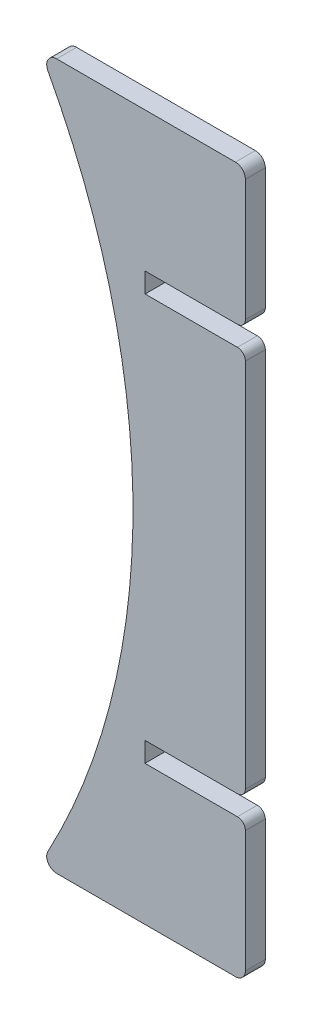
ISO-10303-21;
HEADER;
FILE_DESCRIPTION(('STEP AP214'),'2;1');
FILE_NAME('part.step','',(''),(''),'','','');
FILE_SCHEMA(('AUTOMOTIVE_DESIGN { 1 0 10303 214 1 1 1 1 }'));
ENDSEC;
DATA;
#1=APPLICATION_CONTEXT('core data for automotive mechanical design processes');
#2=APPLICATION_PROTOCOL_DEFINITION('international standard','automotive_design',2000,#1);
#3=PRODUCT_CONTEXT('',#1,'mechanical');
#4=PRODUCT('Part','Part','',(#3));
#5=PRODUCT_RELATED_PRODUCT_CATEGORY('part','',(#4));
#6=PRODUCT_DEFINITION_FORMATION('','',#4);
#7=PRODUCT_DEFINITION_CONTEXT('part definition',#1,'design');
#8=PRODUCT_DEFINITION('design','',#6,#7);
#9=PRODUCT_DEFINITION_SHAPE('','',#8);
#10=(LENGTH_UNIT() NAMED_UNIT(*) SI_UNIT(.MILLI.,.METRE.));
#11=(NAMED_UNIT(*) PLANE_ANGLE_UNIT() SI_UNIT($,.RADIAN.));
#12=(NAMED_UNIT(*) SI_UNIT($,.STERADIAN.) SOLID_ANGLE_UNIT());
#13=UNCERTAINTY_MEASURE_WITH_UNIT(LENGTH_MEASURE(1.E-05),#10,'distance_accuracy_value','');
#14=(GEOMETRIC_REPRESENTATION_CONTEXT(3) GLOBAL_UNCERTAINTY_ASSIGNED_CONTEXT((#13)) GLOBAL_UNIT_ASSIGNED_CONTEXT((#10,
#11,#12)) REPRESENTATION_CONTEXT('',''));
#15=CARTESIAN_POINT('',(0.,0.,0.));
#16=DIRECTION('',(0.,0.,1.));
#17=DIRECTION('',(1.,0.,0.));
#18=AXIS2_PLACEMENT_3D('',#15,#16,#17);
#19=CARTESIAN_POINT('',(8.95890816800005,85.500001303239,5.));
#20=DIRECTION('',(0.,0.,-1.));
#21=DIRECTION('',(-1.,0.,0.));
#22=AXIS2_PLACEMENT_3D('',#19,#20,#21);
#23=CYLINDRICAL_SURFACE('',#22,2.);
#24=CARTESIAN_POINT('',(8.95890816800005,85.500001303239,0.));
#25=DIRECTION('',(0.,0.,1.));
#26=DIRECTION('',(1.,0.,0.));
#27=AXIS2_PLACEMENT_3D('',#24,#25,#26);
#28=CIRCLE('',#27,2.);
#29=CARTESIAN_POINT('',(10.958908168,85.500001303239,0.));
#30=VERTEX_POINT('',#29);
#31=CARTESIAN_POINT('',(8.95890816800005,87.500001303239,0.));
#32=VERTEX_POINT('',#31);
#33=EDGE_CURVE('E201',#30,#32,#28,.T.);
#34=ORIENTED_EDGE('',*,*,#33,.T.);
#35=DIRECTION('',(0.,0.,-1.));
#36=VECTOR('',#35,1.);
#37=CARTESIAN_POINT('',(8.95890816800005,87.500001303239,5.));
#38=LINE('',#37,#36);
#39=CARTESIAN_POINT('',(8.95890816800005,87.500001303239,5.));
#40=VERTEX_POINT('',#39);
#41=EDGE_CURVE('E11',#40,#32,#38,.T.);
#42=ORIENTED_EDGE('',*,*,#41,.F.);
#43=CARTESIAN_POINT('',(8.95890816800005,85.500001303239,5.));
#44=DIRECTION('',(0.,0.,1.));
#45=DIRECTION('',(1.,0.,0.));
#46=AXIS2_PLACEMENT_3D('',#43,#44,#45);
#47=CIRCLE('',#46,2.);
#48=CARTESIAN_POINT('',(10.958908168,85.500001303239,5.));
#49=VERTEX_POINT('',#48);
#50=EDGE_CURVE('E239',#49,#40,#47,.T.);
#51=ORIENTED_EDGE('',*,*,#50,.F.);
#52=DIRECTION('',(0.,0.,-1.));
#53=VECTOR('',#52,1.);
#54=CARTESIAN_POINT('',(10.958908168,85.500001303239,5.));
#55=LINE('',#54,#53);
#56=EDGE_CURVE('E197',#49,#30,#55,.T.);
#57=ORIENTED_EDGE('',*,*,#56,.T.);
#58=EDGE_LOOP('',(#34,#42,#51,#57));
#59=FACE_BOUND('',#58,.T.);
#60=ADVANCED_FACE('F33',(#59),#23,.T.);
#61=CARTESIAN_POINT('',(-14.2050345422933,87.500001303239,5.));
#62=DIRECTION('',(0.,-1.,0.));
#63=DIRECTION('',(0.,0.,-1.));
#64=AXIS2_PLACEMENT_3D('',#61,#62,#63);
#65=PLANE('',#64);
#66=DIRECTION('',(-1.,0.,0.));
#67=VECTOR('',#66,1.);
#68=CARTESIAN_POINT('',(-14.2050345422933,87.500001303239,0.));
#69=LINE('',#68,#67);
#70=CARTESIAN_POINT('',(-14.2050345422933,87.500001303239,0.));
#71=VERTEX_POINT('',#70);
#72=EDGE_CURVE('E204',#32,#71,#69,.T.);
#73=ORIENTED_EDGE('',*,*,#72,.T.);
#74=DIRECTION('',(0.,0.,-1.));
#75=VECTOR('',#74,1.);
#76=CARTESIAN_POINT('',(-14.2050345422933,87.500001303239,5.));
#77=LINE('',#76,#75);
#78=CARTESIAN_POINT('',(-14.2050345422933,87.500001303239,5.));
#79=VERTEX_POINT('',#78);
#80=EDGE_CURVE('E41',#79,#71,#77,.T.);
#81=ORIENTED_EDGE('',*,*,#80,.F.);
#82=DIRECTION('',(-1.,0.,0.));
#83=VECTOR('',#82,1.);
#84=CARTESIAN_POINT('',(-14.2050345422933,87.500001303239,5.));
#85=LINE('',#84,#83);
#86=EDGE_CURVE('E128',#40,#79,#85,.T.);
#87=ORIENTED_EDGE('',*,*,#86,.F.);
#88=ORIENTED_EDGE('',*,*,#41,.T.);
#89=EDGE_LOOP('',(#73,#81,#87,#88));
#90=FACE_BOUND('',#89,.T.);
#91=ADVANCED_FACE('F357',(#90),#65,.F.);
#92=CARTESIAN_POINT('',(-14.2050345422933,92.5000013777448,5.));
#93=DIRECTION('',(-1.,0.,0.));
#94=DIRECTION('',(0.,-1.,0.));
#95=AXIS2_PLACEMENT_3D('',#92,#93,#94);
#96=PLANE('',#95);
#97=DIRECTION('',(0.,1.,0.));
#98=VECTOR('',#97,1.);
#99=CARTESIAN_POINT('',(-14.2050345422933,92.5000013777448,0.));
#100=LINE('',#99,#98);
#101=CARTESIAN_POINT('',(-14.2050345422933,92.5000013777448,0.));
#102=VERTEX_POINT('',#101);
#103=EDGE_CURVE('E206',#71,#102,#100,.T.);
#104=ORIENTED_EDGE('',*,*,#103,.T.);
#105=DIRECTION('',(0.,0.,-1.));
#106=VECTOR('',#105,1.);
#107=CARTESIAN_POINT('',(-14.2050345422933,92.5000013777448,5.));
#108=LINE('',#107,#106);
#109=CARTESIAN_POINT('',(-14.2050345422933,92.5000013777448,5.));
#110=VERTEX_POINT('',#109);
#111=EDGE_CURVE('E282',#110,#102,#108,.T.);
#112=ORIENTED_EDGE('',*,*,#111,.F.);
#113=DIRECTION('',(0.,1.,0.));
#114=VECTOR('',#113,1.);
#115=CARTESIAN_POINT('',(-14.2050345422933,92.5000013777448,5.));
#116=LINE('',#115,#114);
#117=EDGE_CURVE('E290',#79,#110,#116,.T.);
#118=ORIENTED_EDGE('',*,*,#117,.F.);
#119=ORIENTED_EDGE('',*,*,#80,.T.);
#120=EDGE_LOOP('',(#104,#112,#118,#119));
#121=FACE_BOUND('',#120,.T.);
#122=ADVANCED_FACE('F288',(#121),#96,.F.);
#123=CARTESIAN_POINT('',(8.95890816800005,92.5000013777448,5.));
#124=DIRECTION('',(0.,1.,0.));
#125=DIRECTION('',(0.,0.,1.));
#126=AXIS2_PLACEMENT_3D('',#123,#124,#125);
#127=PLANE('',#126);
#128=DIRECTION('',(1.,0.,0.));
#129=VECTOR('',#128,1.);
#130=CARTESIAN_POINT('',(8.95890816800005,92.5000013777448,0.));
#131=LINE('',#130,#129);
#132=CARTESIAN_POINT('',(8.95890816800005,92.5000013777448,0.));
#133=VERTEX_POINT('',#132);
#134=EDGE_CURVE('E208',#102,#133,#131,.T.);
#135=ORIENTED_EDGE('',*,*,#134,.T.);
#136=DIRECTION('',(0.,0.,-1.));
#137=VECTOR('',#136,1.);
#138=CARTESIAN_POINT('',(8.95890816800005,92.5000013777448,5.));
#139=LINE('',#138,#137);
#140=CARTESIAN_POINT('',(8.95890816800005,92.5000013777448,5.));
#141=VERTEX_POINT('',#140);
#142=EDGE_CURVE('E279',#141,#133,#139,.T.);
#143=ORIENTED_EDGE('',*,*,#142,.F.);
#144=DIRECTION('',(1.,0.,0.));
#145=VECTOR('',#144,1.);
#146=CARTESIAN_POINT('',(8.95890816800005,92.5000013777448,5.));
#147=LINE('',#146,#145);
#148=EDGE_CURVE('E308',#110,#141,#147,.T.);
#149=ORIENTED_EDGE('',*,*,#148,.F.);
#150=ORIENTED_EDGE('',*,*,#111,.T.);
#151=EDGE_LOOP('',(#135,#143,#149,#150));
#152=FACE_BOUND('',#151,.T.);
#153=ADVANCED_FACE('F299',(#152),#127,.F.);
#154=CARTESIAN_POINT('',(8.95890816800005,94.5000013777448,5.));
#155=DIRECTION('',(0.,0.,-1.));
#156=DIRECTION('',(-1.,0.,0.));
#157=AXIS2_PLACEMENT_3D('',#154,#155,#156);
#158=CYLINDRICAL_SURFACE('',#157,2.);
#159=CARTESIAN_POINT('',(8.95890816800005,94.5000013777448,0.));
#160=DIRECTION('',(0.,0.,1.));
#161=DIRECTION('',(1.,0.,0.));
#162=AXIS2_PLACEMENT_3D('',#159,#160,#161);
#163=CIRCLE('',#162,2.);
#164=CARTESIAN_POINT('',(10.9589081680001,94.5000013777448,0.));
#165=VERTEX_POINT('',#164);
#166=EDGE_CURVE('E210',#133,#165,#163,.T.);
#167=ORIENTED_EDGE('',*,*,#166,.T.);
#168=DIRECTION('',(0.,0.,-1.));
#169=VECTOR('',#168,1.);
#170=CARTESIAN_POINT('',(10.9589081680001,94.5000013777448,5.));
#171=LINE('',#170,#169);
#172=CARTESIAN_POINT('',(10.9589081680001,94.5000013777448,5.));
#173=VERTEX_POINT('',#172);
#174=EDGE_CURVE('E276',#173,#165,#171,.T.);
#175=ORIENTED_EDGE('',*,*,#174,.F.);
#176=CARTESIAN_POINT('',(8.95890816800005,94.5000013777448,5.));
#177=DIRECTION('',(0.,0.,1.));
#178=DIRECTION('',(1.,0.,0.));
#179=AXIS2_PLACEMENT_3D('',#176,#177,#178);
#180=CIRCLE('',#179,2.);
#181=EDGE_CURVE('E305',#141,#173,#180,.T.);
#182=ORIENTED_EDGE('',*,*,#181,.F.);
#183=ORIENTED_EDGE('',*,*,#142,.T.);
#184=EDGE_LOOP('',(#167,#175,#182,#183));
#185=FACE_BOUND('',#184,.T.);
#186=ADVANCED_FACE('F303',(#185),#158,.T.);
#187=CARTESIAN_POINT('',(10.9589081680001,124.999913592023,5.));
#188=DIRECTION('',(-1.,0.,0.));
#189=DIRECTION('',(0.,-1.,0.));
#190=AXIS2_PLACEMENT_3D('',#187,#188,#189);
#191=PLANE('',#190);
#192=DIRECTION('',(0.,1.,0.));
#193=VECTOR('',#192,1.);
#194=CARTESIAN_POINT('',(10.9589081680001,124.999913592023,0.));
#195=LINE('',#194,#193);
#196=CARTESIAN_POINT('',(10.9589081680001,124.999913592023,0.));
#197=VERTEX_POINT('',#196);
#198=EDGE_CURVE('E212',#165,#197,#195,.T.);
#199=ORIENTED_EDGE('',*,*,#198,.T.);
#200=DIRECTION('',(0.,0.,-1.));
#201=VECTOR('',#200,1.);
#202=CARTESIAN_POINT('',(10.9589081680001,124.999913592023,5.));
#203=LINE('',#202,#201);
#204=CARTESIAN_POINT('',(10.9589081680001,124.999913592023,5.));
#205=VERTEX_POINT('',#204);
#206=EDGE_CURVE('E273',#205,#197,#203,.T.);
#207=ORIENTED_EDGE('',*,*,#206,.F.);
#208=DIRECTION('',(0.,1.,0.));
#209=VECTOR('',#208,1.);
#210=CARTESIAN_POINT('',(10.9589081680001,124.999913592023,5.));
#211=LINE('',#210,#209);
#212=EDGE_CURVE('E307',#173,#205,#211,.T.);
#213=ORIENTED_EDGE('',*,*,#212,.F.);
#214=ORIENTED_EDGE('',*,*,#174,.T.);
#215=EDGE_LOOP('',(#199,#207,#213,#214));
#216=FACE_BOUND('',#215,.T.);
#217=ADVANCED_FACE('F370',(#216),#191,.F.);
#218=CARTESIAN_POINT('',(8.45890816800004,124.999913592023,5.));
#219=DIRECTION('',(0.,0.,-1.));
#220=DIRECTION('',(-1.,0.,0.));
#221=AXIS2_PLACEMENT_3D('',#218,#219,#220);
#222=CYLINDRICAL_SURFACE('',#221,2.50000000000002);
#223=CARTESIAN_POINT('',(8.45890816800004,124.999913592023,0.));
#224=DIRECTION('',(0.,0.,1.));
#225=DIRECTION('',(1.,0.,0.));
#226=AXIS2_PLACEMENT_3D('',#223,#224,#225);
#227=CIRCLE('',#226,2.50000000000002);
#228=CARTESIAN_POINT('',(8.45890816800005,127.499913592023,0.));
#229=VERTEX_POINT('',#228);
#230=EDGE_CURVE('E214',#197,#229,#227,.T.);
#231=ORIENTED_EDGE('',*,*,#230,.T.);
#232=DIRECTION('',(0.,0.,-1.));
#233=VECTOR('',#232,1.);
#234=CARTESIAN_POINT('',(8.45890816800005,127.499913592023,5.));
#235=LINE('',#234,#233);
#236=CARTESIAN_POINT('',(8.45890816800005,127.499913592023,5.));
#237=VERTEX_POINT('',#236);
#238=EDGE_CURVE('E270',#237,#229,#235,.T.);
#239=ORIENTED_EDGE('',*,*,#238,.F.);
#240=CARTESIAN_POINT('',(8.45890816800004,124.999913592023,5.));
#241=DIRECTION('',(0.,0.,1.));
#242=DIRECTION('',(1.,0.,0.));
#243=AXIS2_PLACEMENT_3D('',#240,#241,#242);
#244=CIRCLE('',#243,2.50000000000002);
#245=EDGE_CURVE('E310',#205,#237,#244,.T.);
#246=ORIENTED_EDGE('',*,*,#245,.F.);
#247=ORIENTED_EDGE('',*,*,#206,.T.);
#248=EDGE_LOOP('',(#231,#239,#246,#247));
#249=FACE_BOUND('',#248,.T.);
#250=ADVANCED_FACE('F373',(#249),#222,.T.);
#251=CARTESIAN_POINT('',(-36.3921818460583,127.499913592023,5.));
#252=DIRECTION('',(0.,-1.,0.));
#253=DIRECTION('',(0.,0.,-1.));
#254=AXIS2_PLACEMENT_3D('',#251,#252,#253);
#255=PLANE('',#254);
#256=DIRECTION('',(-1.,0.,0.));
#257=VECTOR('',#256,1.);
#258=CARTESIAN_POINT('',(-36.3921818460583,127.499913592023,0.));
#259=LINE('',#258,#257);
#260=CARTESIAN_POINT('',(-36.3921818460583,127.499913592023,0.));
#261=VERTEX_POINT('',#260);
#262=EDGE_CURVE('E216',#229,#261,#259,.T.);
#263=ORIENTED_EDGE('',*,*,#262,.T.);
#264=DIRECTION('',(0.,0.,-1.));
#265=VECTOR('',#264,1.);
#266=CARTESIAN_POINT('',(-36.3921818460583,127.499913592023,5.));
#267=LINE('',#266,#265);
#268=CARTESIAN_POINT('',(-36.3921818460583,127.499913592023,5.));
#269=VERTEX_POINT('',#268);
#270=EDGE_CURVE('E267',#269,#261,#267,.T.);
#271=ORIENTED_EDGE('',*,*,#270,.F.);
#272=DIRECTION('',(-1.,0.,0.));
#273=VECTOR('',#272,1.);
#274=CARTESIAN_POINT('',(-36.3921818460583,127.499913592023,5.));
#275=LINE('',#274,#273);
#276=EDGE_CURVE('E316',#237,#269,#275,.T.);
#277=ORIENTED_EDGE('',*,*,#276,.F.);
#278=ORIENTED_EDGE('',*,*,#238,.T.);
#279=EDGE_LOOP('',(#263,#271,#277,#278));
#280=FACE_BOUND('',#279,.T.);
#281=ADVANCED_FACE('F377',(#280),#255,.F.);
#282=CARTESIAN_POINT('',(-36.3921818460583,124.999913592023,5.));
#283=DIRECTION('',(0.,0.,-1.));
#284=DIRECTION('',(-1.,0.,0.));
#285=AXIS2_PLACEMENT_3D('',#282,#283,#284);
#286=CYLINDRICAL_SURFACE('',#285,2.50000000000001);
#287=CARTESIAN_POINT('',(-36.3921818460583,124.999913592023,0.));
#288=DIRECTION('',(0.,0.,1.));
#289=DIRECTION('',(1.,0.,0.));
#290=AXIS2_PLACEMENT_3D('',#287,#288,#289);
#291=CIRCLE('',#290,2.50000000000001);
#292=CARTESIAN_POINT('',(-38.6052255018931,123.836970008967,0.));
#293=VERTEX_POINT('',#292);
#294=EDGE_CURVE('E218',#261,#293,#291,.T.);
#295=ORIENTED_EDGE('',*,*,#294,.T.);
#296=DIRECTION('',(0.,0.,-1.));
#297=VECTOR('',#296,1.);
#298=CARTESIAN_POINT('',(-38.6052255018931,123.836970008967,5.));
#299=LINE('',#298,#297);
#300=CARTESIAN_POINT('',(-38.6052255018931,123.836970008967,5.));
#301=VERTEX_POINT('',#300);
#302=EDGE_CURVE('E264',#301,#293,#299,.T.);
#303=ORIENTED_EDGE('',*,*,#302,.F.);
#304=CARTESIAN_POINT('',(-36.3921818460583,124.999913592023,5.));
#305=DIRECTION('',(0.,0.,1.));
#306=DIRECTION('',(1.,0.,0.));
#307=AXIS2_PLACEMENT_3D('',#304,#305,#306);
#308=CIRCLE('',#307,2.50000000000001);
#309=EDGE_CURVE('E318',#269,#301,#308,.T.);
#310=ORIENTED_EDGE('',*,*,#309,.F.);
#311=ORIENTED_EDGE('',*,*,#270,.T.);
#312=EDGE_LOOP('',(#295,#303,#310,#311));
#313=FACE_BOUND('',#312,.T.);
#314=ADVANCED_FACE('F381',(#313),#286,.T.);
#315=CARTESIAN_POINT('',(-196.389342233878,38.9999194120123,5.));
#316=DIRECTION('',(0.,0.,-1.));
#317=DIRECTION('',(-1.,0.,0.));
#318=AXIS2_PLACEMENT_3D('',#315,#316,#317);
#319=CYLINDRICAL_SURFACE('',#318,179.145618553408);
#320=CARTESIAN_POINT('',(-196.389342233878,38.9999194120123,0.));
#321=DIRECTION('',(0.,0.,-1.));
#322=DIRECTION('',(1.,0.,0.));
#323=AXIS2_PLACEMENT_3D('',#320,#321,#322);
#324=CIRCLE('',#323,179.145618553408);
#325=CARTESIAN_POINT('',(-38.6048901554702,-45.8365074882266,0.));
#326=VERTEX_POINT('',#325);
#327=EDGE_CURVE('E220',#293,#326,#324,.T.);
#328=ORIENTED_EDGE('',*,*,#327,.T.);
#329=DIRECTION('',(0.,0.,-1.));
#330=VECTOR('',#329,1.);
#331=CARTESIAN_POINT('',(-38.6048901554702,-45.8365074882266,5.));
#332=LINE('',#331,#330);
#333=CARTESIAN_POINT('',(-38.6048901554702,-45.8365074882266,5.));
#334=VERTEX_POINT('',#333);
#335=EDGE_CURVE('E261',#334,#326,#332,.T.);
#336=ORIENTED_EDGE('',*,*,#335,.F.);
#337=CARTESIAN_POINT('',(-196.389342233878,38.9999194120123,5.));
#338=DIRECTION('',(0.,0.,-1.));
#339=DIRECTION('',(1.,0.,0.));
#340=AXIS2_PLACEMENT_3D('',#337,#338,#339);
#341=CIRCLE('',#340,179.145618553408);
#342=EDGE_CURVE('E320',#301,#334,#341,.T.);
#343=ORIENTED_EDGE('',*,*,#342,.F.);
#344=ORIENTED_EDGE('',*,*,#302,.T.);
#345=EDGE_LOOP('',(#328,#336,#343,#344));
#346=FACE_BOUND('',#345,.T.);
#347=ADVANCED_FACE('F385',(#346),#319,.F.);
#348=CARTESIAN_POINT('',(-36.3921818460583,-47.0000890012541,5.));
#349=DIRECTION('',(0.,0.,-1.));
#350=DIRECTION('',(-1.,0.,0.));
#351=AXIS2_PLACEMENT_3D('',#348,#349,#350);
#352=CYLINDRICAL_SURFACE('',#351,2.5);
#353=CARTESIAN_POINT('',(-36.3921818460583,-47.0000890012541,0.));
#354=DIRECTION('',(0.,0.,1.));
#355=DIRECTION('',(1.,0.,0.));
#356=AXIS2_PLACEMENT_3D('',#353,#354,#355);
#357=CIRCLE('',#356,2.5);
#358=CARTESIAN_POINT('',(-36.3921818460583,-49.5000890012541,0.));
#359=VERTEX_POINT('',#358);
#360=EDGE_CURVE('E222',#326,#359,#357,.T.);
#361=ORIENTED_EDGE('',*,*,#360,.T.);
#362=DIRECTION('',(0.,0.,-1.));
#363=VECTOR('',#362,1.);
#364=CARTESIAN_POINT('',(-36.3921818460583,-49.5000890012541,5.));
#365=LINE('',#364,#363);
#366=CARTESIAN_POINT('',(-36.3921818460583,-49.5000890012541,5.));
#367=VERTEX_POINT('',#366);
#368=EDGE_CURVE('E258',#367,#359,#365,.T.);
#369=ORIENTED_EDGE('',*,*,#368,.F.);
#370=CARTESIAN_POINT('',(-36.3921818460583,-47.0000890012541,5.));
#371=DIRECTION('',(0.,0.,1.));
#372=DIRECTION('',(1.,0.,0.));
#373=AXIS2_PLACEMENT_3D('',#370,#371,#372);
#374=CIRCLE('',#373,2.5);
#375=EDGE_CURVE('E322',#334,#367,#374,.T.);
#376=ORIENTED_EDGE('',*,*,#375,.F.);
#377=ORIENTED_EDGE('',*,*,#335,.T.);
#378=EDGE_LOOP('',(#361,#369,#376,#377));
#379=FACE_BOUND('',#378,.T.);
#380=ADVANCED_FACE('F389',(#379),#352,.T.);
#381=CARTESIAN_POINT('',(8.45890816800003,-49.5000890012541,5.));
#382=DIRECTION('',(0.,1.,0.));
#383=DIRECTION('',(-1.,0.,0.));
#384=AXIS2_PLACEMENT_3D('',#381,#382,#383);
#385=PLANE('',#384);
#386=DIRECTION('',(1.,0.,0.));
#387=VECTOR('',#386,1.);
#388=CARTESIAN_POINT('',(8.45890816800003,-49.5000890012541,0.));
#389=LINE('',#388,#387);
#390=CARTESIAN_POINT('',(8.45890816800003,-49.5000890012541,0.));
#391=VERTEX_POINT('',#390);
#392=EDGE_CURVE('E224',#359,#391,#389,.T.);
#393=ORIENTED_EDGE('',*,*,#392,.T.);
#394=DIRECTION('',(0.,0.,-1.));
#395=VECTOR('',#394,1.);
#396=CARTESIAN_POINT('',(8.45890816800003,-49.5000890012541,5.));
#397=LINE('',#396,#395);
#398=CARTESIAN_POINT('',(8.45890816800003,-49.5000890012541,5.));
#399=VERTEX_POINT('',#398);
#400=EDGE_CURVE('E255',#399,#391,#397,.T.);
#401=ORIENTED_EDGE('',*,*,#400,.F.);
#402=DIRECTION('',(1.,0.,0.));
#403=VECTOR('',#402,1.);
#404=CARTESIAN_POINT('',(8.45890816800003,-49.5000890012541,5.));
#405=LINE('',#404,#403);
#406=EDGE_CURVE('E324',#367,#399,#405,.T.);
#407=ORIENTED_EDGE('',*,*,#406,.F.);
#408=ORIENTED_EDGE('',*,*,#368,.T.);
#409=EDGE_LOOP('',(#393,#401,#407,#408));
#410=FACE_BOUND('',#409,.T.);
#411=ADVANCED_FACE('F393',(#410),#385,.F.);
#412=CARTESIAN_POINT('',(8.45890816800002,-47.0000890012541,5.));
#413=DIRECTION('',(0.,0.,-1.));
#414=DIRECTION('',(-1.,0.,0.));
#415=AXIS2_PLACEMENT_3D('',#412,#413,#414);
#416=CYLINDRICAL_SURFACE('',#415,2.50000000000002);
#417=CARTESIAN_POINT('',(8.45890816800002,-47.0000890012541,0.));
#418=DIRECTION('',(0.,0.,1.));
#419=DIRECTION('',(1.,0.,0.));
#420=AXIS2_PLACEMENT_3D('',#417,#418,#419);
#421=CIRCLE('',#420,2.50000000000002);
#422=CARTESIAN_POINT('',(10.958908168,-47.0000890012541,0.));
#423=VERTEX_POINT('',#422);
#424=EDGE_CURVE('E226',#391,#423,#421,.T.);
#425=ORIENTED_EDGE('',*,*,#424,.T.);
#426=DIRECTION('',(0.,0.,-1.));
#427=VECTOR('',#426,1.);
#428=CARTESIAN_POINT('',(10.958908168,-47.0000890012541,5.));
#429=LINE('',#428,#427);
#430=CARTESIAN_POINT('',(10.958908168,-47.0000890012541,5.));
#431=VERTEX_POINT('',#430);
#432=EDGE_CURVE('E252',#431,#423,#429,.T.);
#433=ORIENTED_EDGE('',*,*,#432,.F.);
#434=CARTESIAN_POINT('',(8.45890816800002,-47.0000890012541,5.));
#435=DIRECTION('',(0.,0.,1.));
#436=DIRECTION('',(1.,0.,0.));
#437=AXIS2_PLACEMENT_3D('',#434,#435,#436);
#438=CIRCLE('',#437,2.50000000000002);
#439=EDGE_CURVE('E326',#399,#431,#438,.T.);
#440=ORIENTED_EDGE('',*,*,#439,.F.);
#441=ORIENTED_EDGE('',*,*,#400,.T.);
#442=EDGE_LOOP('',(#425,#433,#440,#441));
#443=FACE_BOUND('',#442,.T.);
#444=ADVANCED_FACE('F397',(#443),#416,.T.);
#445=CARTESIAN_POINT('',(10.958908168,-16.5000002166794,5.));
#446=DIRECTION('',(-1.,0.,0.));
#447=DIRECTION('',(0.,0.,1.));
#448=AXIS2_PLACEMENT_3D('',#445,#446,#447);
#449=PLANE('',#448);
#450=DIRECTION('',(0.,1.,0.));
#451=VECTOR('',#450,1.);
#452=CARTESIAN_POINT('',(10.958908168,-16.5000002166794,0.));
#453=LINE('',#452,#451);
#454=CARTESIAN_POINT('',(10.958908168,-16.5000002166794,0.));
#455=VERTEX_POINT('',#454);
#456=EDGE_CURVE('E228',#423,#455,#453,.T.);
#457=ORIENTED_EDGE('',*,*,#456,.T.);
#458=DIRECTION('',(0.,0.,-1.));
#459=VECTOR('',#458,1.);
#460=CARTESIAN_POINT('',(10.958908168,-16.5000002166794,5.));
#461=LINE('',#460,#459);
#462=CARTESIAN_POINT('',(10.958908168,-16.5000002166794,5.));
#463=VERTEX_POINT('',#462);
#464=EDGE_CURVE('E249',#463,#455,#461,.T.);
#465=ORIENTED_EDGE('',*,*,#464,.F.);
#466=DIRECTION('',(0.,1.,0.));
#467=VECTOR('',#466,1.);
#468=CARTESIAN_POINT('',(10.958908168,-16.5000002166794,5.));
#469=LINE('',#468,#467);
#470=EDGE_CURVE('E328',#431,#463,#469,.T.);
#471=ORIENTED_EDGE('',*,*,#470,.F.);
#472=ORIENTED_EDGE('',*,*,#432,.T.);
#473=EDGE_LOOP('',(#457,#465,#471,#472));
#474=FACE_BOUND('',#473,.T.);
#475=ADVANCED_FACE('F401',(#474),#449,.F.);
#476=CARTESIAN_POINT('',(8.95890816800004,-16.5000002166794,5.));
#477=DIRECTION('',(0.,0.,-1.));
#478=DIRECTION('',(-1.,0.,0.));
#479=AXIS2_PLACEMENT_3D('',#476,#477,#478);
#480=CYLINDRICAL_SURFACE('',#479,2.);
#481=CARTESIAN_POINT('',(8.95890816800004,-16.5000002166794,0.));
#482=DIRECTION('',(0.,0.,1.));
#483=DIRECTION('',(1.,0.,0.));
#484=AXIS2_PLACEMENT_3D('',#481,#482,#483);
#485=CIRCLE('',#484,2.);
#486=CARTESIAN_POINT('',(8.95890816800004,-14.5000002166794,0.));
#487=VERTEX_POINT('',#486);
#488=EDGE_CURVE('E230',#455,#487,#485,.T.);
#489=ORIENTED_EDGE('',*,*,#488,.T.);
#490=DIRECTION('',(0.,0.,-1.));
#491=VECTOR('',#490,1.);
#492=CARTESIAN_POINT('',(8.95890816800004,-14.5000002166794,5.));
#493=LINE('',#492,#491);
#494=CARTESIAN_POINT('',(8.95890816800004,-14.5000002166794,5.));
#495=VERTEX_POINT('',#494);
#496=EDGE_CURVE('E246',#495,#487,#493,.T.);
#497=ORIENTED_EDGE('',*,*,#496,.F.);
#498=CARTESIAN_POINT('',(8.95890816800004,-16.5000002166794,5.));
#499=DIRECTION('',(0.,0.,1.));
#500=DIRECTION('',(1.,0.,0.));
#501=AXIS2_PLACEMENT_3D('',#498,#499,#500);
#502=CIRCLE('',#501,2.);
#503=EDGE_CURVE('E330',#463,#495,#502,.T.);
#504=ORIENTED_EDGE('',*,*,#503,.F.);
#505=ORIENTED_EDGE('',*,*,#464,.T.);
#506=EDGE_LOOP('',(#489,#497,#504,#505));
#507=FACE_BOUND('',#506,.T.);
#508=ADVANCED_FACE('F405',(#507),#480,.T.);
#509=CARTESIAN_POINT('',(-14.2374255113163,-14.5000002166794,5.));
#510=DIRECTION('',(0.,-1.,0.));
#511=DIRECTION('',(0.,0.,-1.));
#512=AXIS2_PLACEMENT_3D('',#509,#510,#511);
#513=PLANE('',#512);
#514=DIRECTION('',(-1.,0.,0.));
#515=VECTOR('',#514,1.);
#516=CARTESIAN_POINT('',(-14.2374255113163,-14.5000002166794,0.));
#517=LINE('',#516,#515);
#518=CARTESIAN_POINT('',(-14.2374255113163,-14.5000002166794,0.));
#519=VERTEX_POINT('',#518);
#520=EDGE_CURVE('E232',#487,#519,#517,.T.);
#521=ORIENTED_EDGE('',*,*,#520,.T.);
#522=DIRECTION('',(0.,0.,-1.));
#523=VECTOR('',#522,1.);
#524=CARTESIAN_POINT('',(-14.2374255113163,-14.5000002166794,5.));
#525=LINE('',#524,#523);
#526=CARTESIAN_POINT('',(-14.2374255113163,-14.5000002166794,5.));
#527=VERTEX_POINT('',#526);
#528=EDGE_CURVE('E243',#527,#519,#525,.T.);
#529=ORIENTED_EDGE('',*,*,#528,.F.);
#530=DIRECTION('',(-1.,0.,0.));
#531=VECTOR('',#530,1.);
#532=CARTESIAN_POINT('',(-14.2374255113163,-14.5000002166794,5.));
#533=LINE('',#532,#531);
#534=EDGE_CURVE('E332',#495,#527,#533,.T.);
#535=ORIENTED_EDGE('',*,*,#534,.F.);
#536=ORIENTED_EDGE('',*,*,#496,.T.);
#537=EDGE_LOOP('',(#521,#529,#535,#536));
#538=FACE_BOUND('',#537,.T.);
#539=ADVANCED_FACE('F338',(#538),#513,.F.);
#540=CARTESIAN_POINT('',(-14.2374255113163,-9.50000014217361,5.));
#541=DIRECTION('',(-1.,0.,0.));
#542=DIRECTION('',(0.,0.,1.));
#543=AXIS2_PLACEMENT_3D('',#540,#541,#542);
#544=PLANE('',#543);
#545=DIRECTION('',(0.,1.,0.));
#546=VECTOR('',#545,1.);
#547=CARTESIAN_POINT('',(-14.2374255113163,-9.50000014217361,0.));
#548=LINE('',#547,#546);
#549=CARTESIAN_POINT('',(-14.2374255113163,-9.50000014217361,0.));
#550=VERTEX_POINT('',#549);
#551=EDGE_CURVE('E234',#519,#550,#548,.T.);
#552=ORIENTED_EDGE('',*,*,#551,.T.);
#553=DIRECTION('',(0.,0.,-1.));
#554=VECTOR('',#553,1.);
#555=CARTESIAN_POINT('',(-14.2374255113163,-9.50000014217361,5.));
#556=LINE('',#555,#554);
#557=CARTESIAN_POINT('',(-14.2374255113163,-9.50000014217361,5.));
#558=VERTEX_POINT('',#557);
#559=EDGE_CURVE('E192',#558,#550,#556,.T.);
#560=ORIENTED_EDGE('',*,*,#559,.F.);
#561=DIRECTION('',(0.,1.,0.));
#562=VECTOR('',#561,1.);
#563=CARTESIAN_POINT('',(-14.2374255113163,-9.50000014217361,5.));
#564=LINE('',#563,#562);
#565=EDGE_CURVE('E183',#527,#558,#564,.T.);
#566=ORIENTED_EDGE('',*,*,#565,.F.);
#567=ORIENTED_EDGE('',*,*,#528,.T.);
#568=EDGE_LOOP('',(#552,#560,#566,#567));
#569=FACE_BOUND('',#568,.T.);
#570=ADVANCED_FACE('F342',(#569),#544,.F.);
#571=CARTESIAN_POINT('',(8.95890816800004,-9.50000014217361,5.));
#572=DIRECTION('',(0.,1.,0.));
#573=DIRECTION('',(0.,0.,1.));
#574=AXIS2_PLACEMENT_3D('',#571,#572,#573);
#575=PLANE('',#574);
#576=DIRECTION('',(1.,0.,0.));
#577=VECTOR('',#576,1.);
#578=CARTESIAN_POINT('',(8.95890816800004,-9.50000014217361,0.));
#579=LINE('',#578,#577);
#580=CARTESIAN_POINT('',(8.95890816800004,-9.50000014217361,0.));
#581=VERTEX_POINT('',#580);
#582=EDGE_CURVE('E191',#550,#581,#579,.T.);
#583=ORIENTED_EDGE('',*,*,#582,.T.);
#584=DIRECTION('',(0.,0.,-1.));
#585=VECTOR('',#584,1.);
#586=CARTESIAN_POINT('',(8.95890816800004,-9.50000014217361,5.));
#587=LINE('',#586,#585);
#588=CARTESIAN_POINT('',(8.95890816800004,-9.50000014217361,5.));
#589=VERTEX_POINT('',#588);
#590=EDGE_CURVE('E188',#589,#581,#587,.T.);
#591=ORIENTED_EDGE('',*,*,#590,.F.);
#592=DIRECTION('',(1.,0.,0.));
#593=VECTOR('',#592,1.);
#594=CARTESIAN_POINT('',(8.95890816800004,-9.50000014217361,5.));
#595=LINE('',#594,#593);
#596=EDGE_CURVE('E177',#558,#589,#595,.T.);
#597=ORIENTED_EDGE('',*,*,#596,.F.);
#598=ORIENTED_EDGE('',*,*,#559,.T.);
#599=EDGE_LOOP('',(#583,#591,#597,#598));
#600=FACE_BOUND('',#599,.T.);
#601=ADVANCED_FACE('F189',(#600),#575,.F.);
#602=CARTESIAN_POINT('',(8.95890816800005,-7.50000014217361,5.));
#603=DIRECTION('',(0.,0.,-1.));
#604=DIRECTION('',(-1.,0.,0.));
#605=AXIS2_PLACEMENT_3D('',#602,#603,#604);
#606=CYLINDRICAL_SURFACE('',#605,2.);
#607=CARTESIAN_POINT('',(8.95890816800005,-7.50000014217361,0.));
#608=DIRECTION('',(0.,0.,1.));
#609=DIRECTION('',(1.,0.,0.));
#610=AXIS2_PLACEMENT_3D('',#607,#608,#609);
#611=CIRCLE('',#610,2.);
#612=CARTESIAN_POINT('',(10.958908168,-7.50000014217361,0.));
#613=VERTEX_POINT('',#612);
#614=EDGE_CURVE('E114',#581,#613,#611,.T.);
#615=ORIENTED_EDGE('',*,*,#614,.T.);
#616=DIRECTION('',(0.,0.,-1.));
#617=VECTOR('',#616,1.);
#618=CARTESIAN_POINT('',(10.958908168,-7.50000014217361,5.));
#619=LINE('',#618,#617);
#620=CARTESIAN_POINT('',(10.958908168,-7.50000014217361,5.));
#621=VERTEX_POINT('',#620);
#622=EDGE_CURVE('E193',#621,#613,#619,.T.);
#623=ORIENTED_EDGE('',*,*,#622,.F.);
#624=CARTESIAN_POINT('',(8.95890816800005,-7.50000014217361,5.));
#625=DIRECTION('',(0.,0.,1.));
#626=DIRECTION('',(1.,0.,0.));
#627=AXIS2_PLACEMENT_3D('',#624,#625,#626);
#628=CIRCLE('',#627,2.);
#629=EDGE_CURVE('E181',#589,#621,#628,.T.);
#630=ORIENTED_EDGE('',*,*,#629,.F.);
#631=ORIENTED_EDGE('',*,*,#590,.T.);
#632=EDGE_LOOP('',(#615,#623,#630,#631));
#633=FACE_BOUND('',#632,.T.);
#634=ADVANCED_FACE('F195',(#633),#606,.T.);
#635=CARTESIAN_POINT('',(10.958908168,85.500001303239,5.));
#636=DIRECTION('',(-1.,0.,0.));
#637=DIRECTION('',(0.,-1.,0.));
#638=AXIS2_PLACEMENT_3D('',#635,#636,#637);
#639=PLANE('',#638);
#640=DIRECTION('',(0.,1.,0.));
#641=VECTOR('',#640,1.);
#642=CARTESIAN_POINT('',(10.958908168,85.500001303239,0.));
#643=LINE('',#642,#641);
#644=EDGE_CURVE('E120',#613,#30,#643,.T.);
#645=ORIENTED_EDGE('',*,*,#644,.T.);
#646=ORIENTED_EDGE('',*,*,#56,.F.);
#647=DIRECTION('',(0.,1.,0.));
#648=VECTOR('',#647,1.);
#649=CARTESIAN_POINT('',(10.958908168,85.500001303239,5.));
#650=LINE('',#649,#648);
#651=EDGE_CURVE('E49',#621,#49,#650,.T.);
#652=ORIENTED_EDGE('',*,*,#651,.F.);
#653=ORIENTED_EDGE('',*,*,#622,.T.);
#654=EDGE_LOOP('',(#645,#646,#652,#653));
#655=FACE_BOUND('',#654,.T.);
#656=ADVANCED_FACE('F346',(#655),#639,.F.);
#657=CARTESIAN_POINT('',(8.95890816800005,85.500001303239,5.));
#658=DIRECTION('',(0.,0.,1.));
#659=DIRECTION('',(1.,0.,0.));
#660=AXIS2_PLACEMENT_3D('',#657,#658,#659);
#661=PLANE('',#660);
#662=ORIENTED_EDGE('',*,*,#50,.T.);
#663=ORIENTED_EDGE('',*,*,#86,.T.);
#664=ORIENTED_EDGE('',*,*,#117,.T.);
#665=ORIENTED_EDGE('',*,*,#148,.T.);
#666=ORIENTED_EDGE('',*,*,#181,.T.);
#667=ORIENTED_EDGE('',*,*,#212,.T.);
#668=ORIENTED_EDGE('',*,*,#245,.T.);
#669=ORIENTED_EDGE('',*,*,#276,.T.);
#670=ORIENTED_EDGE('',*,*,#309,.T.);
#671=ORIENTED_EDGE('',*,*,#342,.T.);
#672=ORIENTED_EDGE('',*,*,#375,.T.);
#673=ORIENTED_EDGE('',*,*,#406,.T.);
#674=ORIENTED_EDGE('',*,*,#439,.T.);
#675=ORIENTED_EDGE('',*,*,#470,.T.);
#676=ORIENTED_EDGE('',*,*,#503,.T.);
#677=ORIENTED_EDGE('',*,*,#534,.T.);
#678=ORIENTED_EDGE('',*,*,#565,.T.);
#679=ORIENTED_EDGE('',*,*,#596,.T.);
#680=ORIENTED_EDGE('',*,*,#629,.T.);
#681=ORIENTED_EDGE('',*,*,#651,.T.);
#682=EDGE_LOOP('',(#662,#663,#664,#665,#666,#667,#668,#669,#670,#671,#672,#673,#674,#675,#676,
#677,#678,#679,#680,#681));
#683=FACE_BOUND('',#682,.T.);
#684=ADVANCED_FACE('F179',(#683),#661,.T.);
#685=CARTESIAN_POINT('',(8.95890816800005,85.500001303239,0.));
#686=DIRECTION('',(0.,0.,1.));
#687=DIRECTION('',(1.,0.,0.));
#688=AXIS2_PLACEMENT_3D('',#685,#686,#687);
#689=PLANE('',#688);
#690=ORIENTED_EDGE('',*,*,#33,.F.);
#691=ORIENTED_EDGE('',*,*,#644,.F.);
#692=ORIENTED_EDGE('',*,*,#614,.F.);
#693=ORIENTED_EDGE('',*,*,#582,.F.);
#694=ORIENTED_EDGE('',*,*,#551,.F.);
#695=ORIENTED_EDGE('',*,*,#520,.F.);
#696=ORIENTED_EDGE('',*,*,#488,.F.);
#697=ORIENTED_EDGE('',*,*,#456,.F.);
#698=ORIENTED_EDGE('',*,*,#424,.F.);
#699=ORIENTED_EDGE('',*,*,#392,.F.);
#700=ORIENTED_EDGE('',*,*,#360,.F.);
#701=ORIENTED_EDGE('',*,*,#327,.F.);
#702=ORIENTED_EDGE('',*,*,#294,.F.);
#703=ORIENTED_EDGE('',*,*,#262,.F.);
#704=ORIENTED_EDGE('',*,*,#230,.F.);
#705=ORIENTED_EDGE('',*,*,#198,.F.);
#706=ORIENTED_EDGE('',*,*,#166,.F.);
#707=ORIENTED_EDGE('',*,*,#134,.F.);
#708=ORIENTED_EDGE('',*,*,#103,.F.);
#709=ORIENTED_EDGE('',*,*,#72,.F.);
#710=EDGE_LOOP('',(#690,#691,#692,#693,#694,#695,#696,#697,#698,#699,#700,#701,#702,#703,#704,
#705,#706,#707,#708,#709));
#711=FACE_BOUND('',#710,.T.);
#712=ADVANCED_FACE('F294',(#711),#689,.F.);
#713=CLOSED_SHELL('',(#60,#91,#122,#153,#186,#217,#250,#281,#314,#347,#380,#411,#444,#475,#508,
#539,#570,#601,#634,#656,#684,#712));
#714=MANIFOLD_SOLID_BREP('B2',#713);
#715=ADVANCED_BREP_SHAPE_REPRESENTATION('',(#18,#714),#14);
#716=SHAPE_DEFINITION_REPRESENTATION(#9,#715);
ENDSEC;
END-ISO-10303-21;
